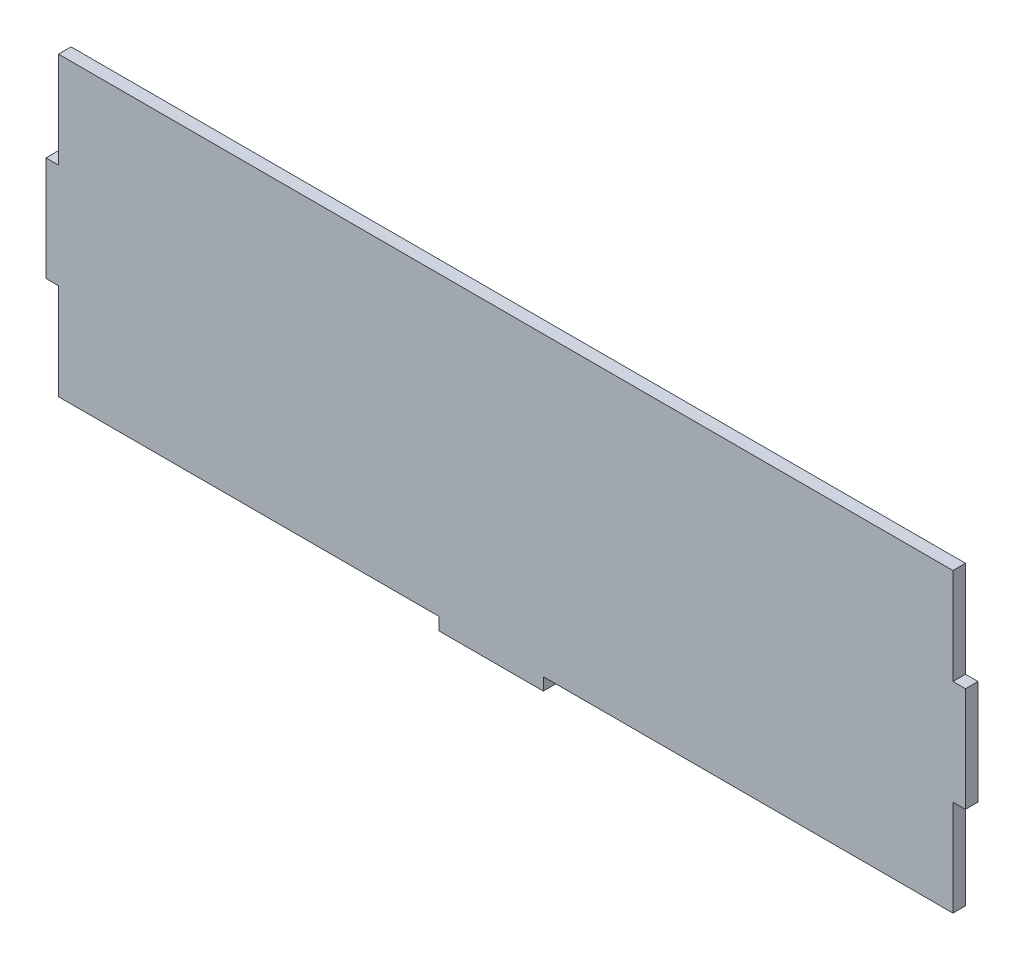
ISO-10303-21;
HEADER;
FILE_DESCRIPTION(('STEP AP214'),'2;1');
FILE_NAME('part.step','',(''),(''),'','','');
FILE_SCHEMA(('AUTOMOTIVE_DESIGN { 1 0 10303 214 1 1 1 1 }'));
ENDSEC;
DATA;
#1=APPLICATION_CONTEXT('core data for automotive mechanical design processes');
#2=APPLICATION_PROTOCOL_DEFINITION('international standard','automotive_design',2000,#1);
#3=PRODUCT_CONTEXT('',#1,'mechanical');
#4=PRODUCT('Part','Part','',(#3));
#5=PRODUCT_RELATED_PRODUCT_CATEGORY('part','',(#4));
#6=PRODUCT_DEFINITION_FORMATION('','',#4);
#7=PRODUCT_DEFINITION_CONTEXT('part definition',#1,'design');
#8=PRODUCT_DEFINITION('design','',#6,#7);
#9=PRODUCT_DEFINITION_SHAPE('','',#8);
#10=(LENGTH_UNIT() NAMED_UNIT(*) SI_UNIT(.MILLI.,.METRE.));
#11=(NAMED_UNIT(*) PLANE_ANGLE_UNIT() SI_UNIT($,.RADIAN.));
#12=(NAMED_UNIT(*) SI_UNIT($,.STERADIAN.) SOLID_ANGLE_UNIT());
#13=UNCERTAINTY_MEASURE_WITH_UNIT(LENGTH_MEASURE(1.E-05),#10,'distance_accuracy_value','');
#14=(GEOMETRIC_REPRESENTATION_CONTEXT(3) GLOBAL_UNCERTAINTY_ASSIGNED_CONTEXT((#13)) GLOBAL_UNIT_ASSIGNED_CONTEXT((#10,
#11,#12)) REPRESENTATION_CONTEXT('',''));
#15=CARTESIAN_POINT('',(0.,0.,0.));
#16=DIRECTION('',(0.,0.,1.));
#17=DIRECTION('',(1.,0.,0.));
#18=AXIS2_PLACEMENT_3D('',#15,#16,#17);
#19=CARTESIAN_POINT('',(0.,0.,6.));
#20=DIRECTION('',(1.,0.,0.));
#21=DIRECTION('',(0.,0.,-1.));
#22=AXIS2_PLACEMENT_3D('',#19,#20,#21);
#23=PLANE('',#22);
#24=DIRECTION('',(0.,-1.,0.));
#25=VECTOR('',#24,1.);
#26=CARTESIAN_POINT('',(0.,0.,0.));
#27=LINE('',#26,#25);
#28=CARTESIAN_POINT('',(0.,0.,0.));
#29=VERTEX_POINT('',#28);
#30=CARTESIAN_POINT('',(0.,-46.,0.));
#31=VERTEX_POINT('',#30);
#32=EDGE_CURVE('E179',#29,#31,#27,.T.);
#33=ORIENTED_EDGE('',*,*,#32,.T.);
#34=DIRECTION('',(0.,0.,-1.));
#35=VECTOR('',#34,1.);
#36=CARTESIAN_POINT('',(0.,-46.,6.));
#37=LINE('',#36,#35);
#38=CARTESIAN_POINT('',(0.,-46.,6.));
#39=VERTEX_POINT('',#38);
#40=EDGE_CURVE('E11',#39,#31,#37,.T.);
#41=ORIENTED_EDGE('',*,*,#40,.F.);
#42=DIRECTION('',(0.,-1.,0.));
#43=VECTOR('',#42,1.);
#44=CARTESIAN_POINT('',(0.,0.,6.));
#45=LINE('',#44,#43);
#46=CARTESIAN_POINT('',(0.,0.,6.));
#47=VERTEX_POINT('',#46);
#48=EDGE_CURVE('E209',#47,#39,#45,.T.);
#49=ORIENTED_EDGE('',*,*,#48,.F.);
#50=DIRECTION('',(0.,0.,-1.));
#51=VECTOR('',#50,1.);
#52=CARTESIAN_POINT('',(0.,0.,6.));
#53=LINE('',#52,#51);
#54=EDGE_CURVE('E175',#47,#29,#53,.T.);
#55=ORIENTED_EDGE('',*,*,#54,.T.);
#56=EDGE_LOOP('',(#33,#41,#49,#55));
#57=FACE_BOUND('',#56,.T.);
#58=ADVANCED_FACE('F35',(#57),#23,.F.);
#59=CARTESIAN_POINT('',(-5.99999999999999,-45.9999999999999,6.));
#60=DIRECTION('',(0.,-1.,0.));
#61=DIRECTION('',(1.,0.,0.));
#62=AXIS2_PLACEMENT_3D('',#59,#60,#61);
#63=PLANE('',#62);
#64=DIRECTION('',(-1.,0.,0.));
#65=VECTOR('',#64,1.);
#66=CARTESIAN_POINT('',(-5.99999999999999,-45.9999999999999,0.));
#67=LINE('',#66,#65);
#68=CARTESIAN_POINT('',(-5.99999999999999,-45.9999999999999,0.));
#69=VERTEX_POINT('',#68);
#70=EDGE_CURVE('E182',#31,#69,#67,.T.);
#71=ORIENTED_EDGE('',*,*,#70,.T.);
#72=DIRECTION('',(0.,0.,-1.));
#73=VECTOR('',#72,1.);
#74=CARTESIAN_POINT('',(-5.99999999999999,-45.9999999999999,6.));
#75=LINE('',#74,#73);
#76=CARTESIAN_POINT('',(-5.99999999999999,-45.9999999999999,6.));
#77=VERTEX_POINT('',#76);
#78=EDGE_CURVE('E43',#77,#69,#75,.T.);
#79=ORIENTED_EDGE('',*,*,#78,.F.);
#80=DIRECTION('',(-1.,0.,0.));
#81=VECTOR('',#80,1.);
#82=CARTESIAN_POINT('',(-5.99999999999999,-45.9999999999999,6.));
#83=LINE('',#82,#81);
#84=EDGE_CURVE('E118',#39,#77,#83,.T.);
#85=ORIENTED_EDGE('',*,*,#84,.F.);
#86=ORIENTED_EDGE('',*,*,#40,.T.);
#87=EDGE_LOOP('',(#71,#79,#85,#86));
#88=FACE_BOUND('',#87,.T.);
#89=ADVANCED_FACE('F307',(#88),#63,.F.);
#90=CARTESIAN_POINT('',(-5.99999999999999,-45.9999999999999,6.));
#91=DIRECTION('',(1.,0.,0.));
#92=DIRECTION('',(0.,1.,0.));
#93=AXIS2_PLACEMENT_3D('',#90,#91,#92);
#94=PLANE('',#93);
#95=DIRECTION('',(0.,-1.,0.));
#96=VECTOR('',#95,1.);
#97=CARTESIAN_POINT('',(-5.99999999999999,-45.9999999999999,0.));
#98=LINE('',#97,#96);
#99=CARTESIAN_POINT('',(-5.99999999999999,-95.9999999999999,0.));
#100=VERTEX_POINT('',#99);
#101=EDGE_CURVE('E184',#69,#100,#98,.T.);
#102=ORIENTED_EDGE('',*,*,#101,.T.);
#103=DIRECTION('',(0.,0.,-1.));
#104=VECTOR('',#103,1.);
#105=CARTESIAN_POINT('',(-5.99999999999999,-95.9999999999999,6.));
#106=LINE('',#105,#104);
#107=CARTESIAN_POINT('',(-5.99999999999999,-95.9999999999999,6.));
#108=VERTEX_POINT('',#107);
#109=EDGE_CURVE('E240',#108,#100,#106,.T.);
#110=ORIENTED_EDGE('',*,*,#109,.F.);
#111=DIRECTION('',(0.,-1.,0.));
#112=VECTOR('',#111,1.);
#113=CARTESIAN_POINT('',(-5.99999999999999,-45.9999999999999,6.));
#114=LINE('',#113,#112);
#115=EDGE_CURVE('E248',#77,#108,#114,.T.);
#116=ORIENTED_EDGE('',*,*,#115,.F.);
#117=ORIENTED_EDGE('',*,*,#78,.T.);
#118=EDGE_LOOP('',(#102,#110,#116,#117));
#119=FACE_BOUND('',#118,.T.);
#120=ADVANCED_FACE('F246',(#119),#94,.F.);
#121=CARTESIAN_POINT('',(-5.99999999999999,-95.9999999999999,6.));
#122=DIRECTION('',(0.,1.,0.));
#123=DIRECTION('',(-1.,0.,0.));
#124=AXIS2_PLACEMENT_3D('',#121,#122,#123);
#125=PLANE('',#124);
#126=DIRECTION('',(1.,0.,0.));
#127=VECTOR('',#126,1.);
#128=CARTESIAN_POINT('',(-5.99999999999999,-95.9999999999999,0.));
#129=LINE('',#128,#127);
#130=CARTESIAN_POINT('',(0.,-96.,0.));
#131=VERTEX_POINT('',#130);
#132=EDGE_CURVE('E186',#100,#131,#129,.T.);
#133=ORIENTED_EDGE('',*,*,#132,.T.);
#134=DIRECTION('',(0.,0.,-1.));
#135=VECTOR('',#134,1.);
#136=CARTESIAN_POINT('',(0.,-96.,6.));
#137=LINE('',#136,#135);
#138=CARTESIAN_POINT('',(0.,-96.,6.));
#139=VERTEX_POINT('',#138);
#140=EDGE_CURVE('E237',#139,#131,#137,.T.);
#141=ORIENTED_EDGE('',*,*,#140,.F.);
#142=DIRECTION('',(1.,0.,0.));
#143=VECTOR('',#142,1.);
#144=CARTESIAN_POINT('',(-5.99999999999999,-95.9999999999999,6.));
#145=LINE('',#144,#143);
#146=EDGE_CURVE('E266',#108,#139,#145,.T.);
#147=ORIENTED_EDGE('',*,*,#146,.F.);
#148=ORIENTED_EDGE('',*,*,#109,.T.);
#149=EDGE_LOOP('',(#133,#141,#147,#148));
#150=FACE_BOUND('',#149,.T.);
#151=ADVANCED_FACE('F257',(#150),#125,.F.);
#152=CARTESIAN_POINT('',(0.,-96.,6.));
#153=DIRECTION('',(1.,0.,0.));
#154=DIRECTION('',(0.,1.,0.));
#155=AXIS2_PLACEMENT_3D('',#152,#153,#154);
#156=PLANE('',#155);
#157=DIRECTION('',(0.,-1.,0.));
#158=VECTOR('',#157,1.);
#159=CARTESIAN_POINT('',(0.,-96.,0.));
#160=LINE('',#159,#158);
#161=CARTESIAN_POINT('',(0.,-142.,0.));
#162=VERTEX_POINT('',#161);
#163=EDGE_CURVE('E188',#131,#162,#160,.T.);
#164=ORIENTED_EDGE('',*,*,#163,.T.);
#165=DIRECTION('',(0.,0.,-1.));
#166=VECTOR('',#165,1.);
#167=CARTESIAN_POINT('',(0.,-142.,6.));
#168=LINE('',#167,#166);
#169=CARTESIAN_POINT('',(0.,-142.,6.));
#170=VERTEX_POINT('',#169);
#171=EDGE_CURVE('E234',#170,#162,#168,.T.);
#172=ORIENTED_EDGE('',*,*,#171,.F.);
#173=DIRECTION('',(0.,-1.,0.));
#174=VECTOR('',#173,1.);
#175=CARTESIAN_POINT('',(0.,-96.,6.));
#176=LINE('',#175,#174);
#177=EDGE_CURVE('E263',#139,#170,#176,.T.);
#178=ORIENTED_EDGE('',*,*,#177,.F.);
#179=ORIENTED_EDGE('',*,*,#140,.T.);
#180=EDGE_LOOP('',(#164,#172,#178,#179));
#181=FACE_BOUND('',#180,.T.);
#182=ADVANCED_FACE('F261',(#181),#156,.F.);
#183=CARTESIAN_POINT('',(0.,-142.,6.));
#184=DIRECTION('',(0.,1.,0.));
#185=DIRECTION('',(0.,0.,1.));
#186=AXIS2_PLACEMENT_3D('',#183,#184,#185);
#187=PLANE('',#186);
#188=DIRECTION('',(1.,0.,0.));
#189=VECTOR('',#188,1.);
#190=CARTESIAN_POINT('',(0.,-142.,0.));
#191=LINE('',#190,#189);
#192=CARTESIAN_POINT('',(182.,-142.,0.));
#193=VERTEX_POINT('',#192);
#194=EDGE_CURVE('E190',#162,#193,#191,.T.);
#195=ORIENTED_EDGE('',*,*,#194,.T.);
#196=DIRECTION('',(0.,0.,-1.));
#197=VECTOR('',#196,1.);
#198=CARTESIAN_POINT('',(182.,-142.,6.));
#199=LINE('',#198,#197);
#200=CARTESIAN_POINT('',(182.,-142.,6.));
#201=VERTEX_POINT('',#200);
#202=EDGE_CURVE('E231',#201,#193,#199,.T.);
#203=ORIENTED_EDGE('',*,*,#202,.F.);
#204=DIRECTION('',(1.,0.,0.));
#205=VECTOR('',#204,1.);
#206=CARTESIAN_POINT('',(0.,-142.,6.));
#207=LINE('',#206,#205);
#208=EDGE_CURVE('E265',#170,#201,#207,.T.);
#209=ORIENTED_EDGE('',*,*,#208,.F.);
#210=ORIENTED_EDGE('',*,*,#171,.T.);
#211=EDGE_LOOP('',(#195,#203,#209,#210));
#212=FACE_BOUND('',#211,.T.);
#213=ADVANCED_FACE('F320',(#212),#187,.F.);
#214=CARTESIAN_POINT('',(182.,-142.,6.));
#215=DIRECTION('',(1.,0.,0.));
#216=DIRECTION('',(0.,0.,-1.));
#217=AXIS2_PLACEMENT_3D('',#214,#215,#216);
#218=PLANE('',#217);
#219=DIRECTION('',(0.,-1.,0.));
#220=VECTOR('',#219,1.);
#221=CARTESIAN_POINT('',(182.,-142.,0.));
#222=LINE('',#221,#220);
#223=CARTESIAN_POINT('',(182.,-148.,0.));
#224=VERTEX_POINT('',#223);
#225=EDGE_CURVE('E192',#193,#224,#222,.T.);
#226=ORIENTED_EDGE('',*,*,#225,.T.);
#227=DIRECTION('',(0.,0.,-1.));
#228=VECTOR('',#227,1.);
#229=CARTESIAN_POINT('',(182.,-148.,6.));
#230=LINE('',#229,#228);
#231=CARTESIAN_POINT('',(182.,-148.,6.));
#232=VERTEX_POINT('',#231);
#233=EDGE_CURVE('E228',#232,#224,#230,.T.);
#234=ORIENTED_EDGE('',*,*,#233,.F.);
#235=DIRECTION('',(0.,-1.,0.));
#236=VECTOR('',#235,1.);
#237=CARTESIAN_POINT('',(182.,-142.,6.));
#238=LINE('',#237,#236);
#239=EDGE_CURVE('E268',#201,#232,#238,.T.);
#240=ORIENTED_EDGE('',*,*,#239,.F.);
#241=ORIENTED_EDGE('',*,*,#202,.T.);
#242=EDGE_LOOP('',(#226,#234,#240,#241));
#243=FACE_BOUND('',#242,.T.);
#244=ADVANCED_FACE('F323',(#243),#218,.F.);
#245=CARTESIAN_POINT('',(182.,-148.,6.));
#246=DIRECTION('',(0.,1.,0.));
#247=DIRECTION('',(0.,0.,1.));
#248=AXIS2_PLACEMENT_3D('',#245,#246,#247);
#249=PLANE('',#248);
#250=DIRECTION('',(1.,0.,0.));
#251=VECTOR('',#250,1.);
#252=CARTESIAN_POINT('',(182.,-148.,0.));
#253=LINE('',#252,#251);
#254=CARTESIAN_POINT('',(232.,-148.,0.));
#255=VERTEX_POINT('',#254);
#256=EDGE_CURVE('E194',#224,#255,#253,.T.);
#257=ORIENTED_EDGE('',*,*,#256,.T.);
#258=DIRECTION('',(0.,0.,-1.));
#259=VECTOR('',#258,1.);
#260=CARTESIAN_POINT('',(232.,-148.,6.));
#261=LINE('',#260,#259);
#262=CARTESIAN_POINT('',(232.,-148.,6.));
#263=VERTEX_POINT('',#262);
#264=EDGE_CURVE('E225',#263,#255,#261,.T.);
#265=ORIENTED_EDGE('',*,*,#264,.F.);
#266=DIRECTION('',(1.,0.,0.));
#267=VECTOR('',#266,1.);
#268=CARTESIAN_POINT('',(182.,-148.,6.));
#269=LINE('',#268,#267);
#270=EDGE_CURVE('E274',#232,#263,#269,.T.);
#271=ORIENTED_EDGE('',*,*,#270,.F.);
#272=ORIENTED_EDGE('',*,*,#233,.T.);
#273=EDGE_LOOP('',(#257,#265,#271,#272));
#274=FACE_BOUND('',#273,.T.);
#275=ADVANCED_FACE('F327',(#274),#249,.F.);
#276=CARTESIAN_POINT('',(232.,-142.,6.));
#277=DIRECTION('',(-1.,0.,0.));
#278=DIRECTION('',(0.,0.,1.));
#279=AXIS2_PLACEMENT_3D('',#276,#277,#278);
#280=PLANE('',#279);
#281=DIRECTION('',(0.,1.,0.));
#282=VECTOR('',#281,1.);
#283=CARTESIAN_POINT('',(232.,-142.,0.));
#284=LINE('',#283,#282);
#285=CARTESIAN_POINT('',(232.,-142.,0.));
#286=VERTEX_POINT('',#285);
#287=EDGE_CURVE('E196',#255,#286,#284,.T.);
#288=ORIENTED_EDGE('',*,*,#287,.T.);
#289=DIRECTION('',(0.,0.,-1.));
#290=VECTOR('',#289,1.);
#291=CARTESIAN_POINT('',(232.,-142.,6.));
#292=LINE('',#291,#290);
#293=CARTESIAN_POINT('',(232.,-142.,6.));
#294=VERTEX_POINT('',#293);
#295=EDGE_CURVE('E222',#294,#286,#292,.T.);
#296=ORIENTED_EDGE('',*,*,#295,.F.);
#297=DIRECTION('',(0.,1.,0.));
#298=VECTOR('',#297,1.);
#299=CARTESIAN_POINT('',(232.,-142.,6.));
#300=LINE('',#299,#298);
#301=EDGE_CURVE('E276',#263,#294,#300,.T.);
#302=ORIENTED_EDGE('',*,*,#301,.F.);
#303=ORIENTED_EDGE('',*,*,#264,.T.);
#304=EDGE_LOOP('',(#288,#296,#302,#303));
#305=FACE_BOUND('',#304,.T.);
#306=ADVANCED_FACE('F331',(#305),#280,.F.);
#307=CARTESIAN_POINT('',(232.,-142.,6.));
#308=DIRECTION('',(0.,1.,0.));
#309=DIRECTION('',(-1.,0.,0.));
#310=AXIS2_PLACEMENT_3D('',#307,#308,#309);
#311=PLANE('',#310);
#312=DIRECTION('',(1.,0.,0.));
#313=VECTOR('',#312,1.);
#314=CARTESIAN_POINT('',(232.,-142.,0.));
#315=LINE('',#314,#313);
#316=CARTESIAN_POINT('',(428.,-142.,0.));
#317=VERTEX_POINT('',#316);
#318=EDGE_CURVE('E198',#286,#317,#315,.T.);
#319=ORIENTED_EDGE('',*,*,#318,.T.);
#320=DIRECTION('',(0.,0.,-1.));
#321=VECTOR('',#320,1.);
#322=CARTESIAN_POINT('',(428.,-142.,6.));
#323=LINE('',#322,#321);
#324=CARTESIAN_POINT('',(428.,-142.,6.));
#325=VERTEX_POINT('',#324);
#326=EDGE_CURVE('E219',#325,#317,#323,.T.);
#327=ORIENTED_EDGE('',*,*,#326,.F.);
#328=DIRECTION('',(1.,0.,0.));
#329=VECTOR('',#328,1.);
#330=CARTESIAN_POINT('',(232.,-142.,6.));
#331=LINE('',#330,#329);
#332=EDGE_CURVE('E278',#294,#325,#331,.T.);
#333=ORIENTED_EDGE('',*,*,#332,.F.);
#334=ORIENTED_EDGE('',*,*,#295,.T.);
#335=EDGE_LOOP('',(#319,#327,#333,#334));
#336=FACE_BOUND('',#335,.T.);
#337=ADVANCED_FACE('F335',(#336),#311,.F.);
#338=CARTESIAN_POINT('',(428.,-95.9999999999999,6.));
#339=DIRECTION('',(-1.,0.,0.));
#340=DIRECTION('',(0.,0.,1.));
#341=AXIS2_PLACEMENT_3D('',#338,#339,#340);
#342=PLANE('',#341);
#343=DIRECTION('',(0.,1.,0.));
#344=VECTOR('',#343,1.);
#345=CARTESIAN_POINT('',(428.,-95.9999999999999,0.));
#346=LINE('',#345,#344);
#347=CARTESIAN_POINT('',(428.,-95.9999999999999,0.));
#348=VERTEX_POINT('',#347);
#349=EDGE_CURVE('E200',#317,#348,#346,.T.);
#350=ORIENTED_EDGE('',*,*,#349,.T.);
#351=DIRECTION('',(0.,0.,-1.));
#352=VECTOR('',#351,1.);
#353=CARTESIAN_POINT('',(428.,-95.9999999999999,6.));
#354=LINE('',#353,#352);
#355=CARTESIAN_POINT('',(428.,-95.9999999999999,6.));
#356=VERTEX_POINT('',#355);
#357=EDGE_CURVE('E216',#356,#348,#354,.T.);
#358=ORIENTED_EDGE('',*,*,#357,.F.);
#359=DIRECTION('',(0.,1.,0.));
#360=VECTOR('',#359,1.);
#361=CARTESIAN_POINT('',(428.,-95.9999999999999,6.));
#362=LINE('',#361,#360);
#363=EDGE_CURVE('E280',#325,#356,#362,.T.);
#364=ORIENTED_EDGE('',*,*,#363,.F.);
#365=ORIENTED_EDGE('',*,*,#326,.T.);
#366=EDGE_LOOP('',(#350,#358,#364,#365));
#367=FACE_BOUND('',#366,.T.);
#368=ADVANCED_FACE('F339',(#367),#342,.F.);
#369=CARTESIAN_POINT('',(434.,-95.9999999999999,6.));
#370=DIRECTION('',(0.,1.,0.));
#371=DIRECTION('',(-1.,0.,0.));
#372=AXIS2_PLACEMENT_3D('',#369,#370,#371);
#373=PLANE('',#372);
#374=DIRECTION('',(1.,0.,0.));
#375=VECTOR('',#374,1.);
#376=CARTESIAN_POINT('',(434.,-95.9999999999999,0.));
#377=LINE('',#376,#375);
#378=CARTESIAN_POINT('',(434.,-95.9999999999999,0.));
#379=VERTEX_POINT('',#378);
#380=EDGE_CURVE('E202',#348,#379,#377,.T.);
#381=ORIENTED_EDGE('',*,*,#380,.T.);
#382=DIRECTION('',(0.,0.,-1.));
#383=VECTOR('',#382,1.);
#384=CARTESIAN_POINT('',(434.,-95.9999999999999,6.));
#385=LINE('',#384,#383);
#386=CARTESIAN_POINT('',(434.,-95.9999999999999,6.));
#387=VERTEX_POINT('',#386);
#388=EDGE_CURVE('E213',#387,#379,#385,.T.);
#389=ORIENTED_EDGE('',*,*,#388,.F.);
#390=DIRECTION('',(1.,0.,0.));
#391=VECTOR('',#390,1.);
#392=CARTESIAN_POINT('',(434.,-95.9999999999999,6.));
#393=LINE('',#392,#391);
#394=EDGE_CURVE('E282',#356,#387,#393,.T.);
#395=ORIENTED_EDGE('',*,*,#394,.F.);
#396=ORIENTED_EDGE('',*,*,#357,.T.);
#397=EDGE_LOOP('',(#381,#389,#395,#396));
#398=FACE_BOUND('',#397,.T.);
#399=ADVANCED_FACE('F288',(#398),#373,.F.);
#400=CARTESIAN_POINT('',(434.,-45.9999999999999,6.));
#401=DIRECTION('',(-1.,0.,0.));
#402=DIRECTION('',(0.,-1.,0.));
#403=AXIS2_PLACEMENT_3D('',#400,#401,#402);
#404=PLANE('',#403);
#405=DIRECTION('',(0.,1.,0.));
#406=VECTOR('',#405,1.);
#407=CARTESIAN_POINT('',(434.,-45.9999999999999,0.));
#408=LINE('',#407,#406);
#409=CARTESIAN_POINT('',(434.,-45.9999999999999,0.));
#410=VERTEX_POINT('',#409);
#411=EDGE_CURVE('E204',#379,#410,#408,.T.);
#412=ORIENTED_EDGE('',*,*,#411,.T.);
#413=DIRECTION('',(0.,0.,-1.));
#414=VECTOR('',#413,1.);
#415=CARTESIAN_POINT('',(434.,-45.9999999999999,6.));
#416=LINE('',#415,#414);
#417=CARTESIAN_POINT('',(434.,-45.9999999999999,6.));
#418=VERTEX_POINT('',#417);
#419=EDGE_CURVE('E170',#418,#410,#416,.T.);
#420=ORIENTED_EDGE('',*,*,#419,.F.);
#421=DIRECTION('',(0.,1.,0.));
#422=VECTOR('',#421,1.);
#423=CARTESIAN_POINT('',(434.,-45.9999999999999,6.));
#424=LINE('',#423,#422);
#425=EDGE_CURVE('E161',#387,#418,#424,.T.);
#426=ORIENTED_EDGE('',*,*,#425,.F.);
#427=ORIENTED_EDGE('',*,*,#388,.T.);
#428=EDGE_LOOP('',(#412,#420,#426,#427));
#429=FACE_BOUND('',#428,.T.);
#430=ADVANCED_FACE('F292',(#429),#404,.F.);
#431=CARTESIAN_POINT('',(434.,-45.9999999999999,6.));
#432=DIRECTION('',(0.,-1.,0.));
#433=DIRECTION('',(1.,0.,0.));
#434=AXIS2_PLACEMENT_3D('',#431,#432,#433);
#435=PLANE('',#434);
#436=DIRECTION('',(-1.,0.,0.));
#437=VECTOR('',#436,1.);
#438=CARTESIAN_POINT('',(434.,-45.9999999999999,0.));
#439=LINE('',#438,#437);
#440=CARTESIAN_POINT('',(428.,-45.9999999999999,0.));
#441=VERTEX_POINT('',#440);
#442=EDGE_CURVE('E169',#410,#441,#439,.T.);
#443=ORIENTED_EDGE('',*,*,#442,.T.);
#444=DIRECTION('',(0.,0.,-1.));
#445=VECTOR('',#444,1.);
#446=CARTESIAN_POINT('',(428.,-45.9999999999999,6.));
#447=LINE('',#446,#445);
#448=CARTESIAN_POINT('',(428.,-45.9999999999999,6.));
#449=VERTEX_POINT('',#448);
#450=EDGE_CURVE('E166',#449,#441,#447,.T.);
#451=ORIENTED_EDGE('',*,*,#450,.F.);
#452=DIRECTION('',(-1.,0.,0.));
#453=VECTOR('',#452,1.);
#454=CARTESIAN_POINT('',(434.,-45.9999999999999,6.));
#455=LINE('',#454,#453);
#456=EDGE_CURVE('E155',#418,#449,#455,.T.);
#457=ORIENTED_EDGE('',*,*,#456,.F.);
#458=ORIENTED_EDGE('',*,*,#419,.T.);
#459=EDGE_LOOP('',(#443,#451,#457,#458));
#460=FACE_BOUND('',#459,.T.);
#461=ADVANCED_FACE('F167',(#460),#435,.F.);
#462=CARTESIAN_POINT('',(428.,0.,6.));
#463=DIRECTION('',(-1.,0.,0.));
#464=DIRECTION('',(0.,0.,1.));
#465=AXIS2_PLACEMENT_3D('',#462,#463,#464);
#466=PLANE('',#465);
#467=DIRECTION('',(0.,1.,0.));
#468=VECTOR('',#467,1.);
#469=CARTESIAN_POINT('',(428.,0.,0.));
#470=LINE('',#469,#468);
#471=CARTESIAN_POINT('',(428.,0.,0.));
#472=VERTEX_POINT('',#471);
#473=EDGE_CURVE('E104',#441,#472,#470,.T.);
#474=ORIENTED_EDGE('',*,*,#473,.T.);
#475=DIRECTION('',(0.,0.,-1.));
#476=VECTOR('',#475,1.);
#477=CARTESIAN_POINT('',(428.,0.,6.));
#478=LINE('',#477,#476);
#479=CARTESIAN_POINT('',(428.,0.,6.));
#480=VERTEX_POINT('',#479);
#481=EDGE_CURVE('E171',#480,#472,#478,.T.);
#482=ORIENTED_EDGE('',*,*,#481,.F.);
#483=DIRECTION('',(0.,1.,0.));
#484=VECTOR('',#483,1.);
#485=CARTESIAN_POINT('',(428.,0.,6.));
#486=LINE('',#485,#484);
#487=EDGE_CURVE('E159',#449,#480,#486,.T.);
#488=ORIENTED_EDGE('',*,*,#487,.F.);
#489=ORIENTED_EDGE('',*,*,#450,.T.);
#490=EDGE_LOOP('',(#474,#482,#488,#489));
#491=FACE_BOUND('',#490,.T.);
#492=ADVANCED_FACE('F173',(#491),#466,.F.);
#493=CARTESIAN_POINT('',(0.,0.,6.));
#494=DIRECTION('',(0.,-1.,0.));
#495=DIRECTION('',(1.,0.,0.));
#496=AXIS2_PLACEMENT_3D('',#493,#494,#495);
#497=PLANE('',#496);
#498=DIRECTION('',(-1.,0.,0.));
#499=VECTOR('',#498,1.);
#500=CARTESIAN_POINT('',(0.,0.,0.));
#501=LINE('',#500,#499);
#502=EDGE_CURVE('E110',#472,#29,#501,.T.);
#503=ORIENTED_EDGE('',*,*,#502,.T.);
#504=ORIENTED_EDGE('',*,*,#54,.F.);
#505=DIRECTION('',(-1.,0.,0.));
#506=VECTOR('',#505,1.);
#507=CARTESIAN_POINT('',(0.,0.,6.));
#508=LINE('',#507,#506);
#509=EDGE_CURVE('E51',#480,#47,#508,.T.);
#510=ORIENTED_EDGE('',*,*,#509,.F.);
#511=ORIENTED_EDGE('',*,*,#481,.T.);
#512=EDGE_LOOP('',(#503,#504,#510,#511));
#513=FACE_BOUND('',#512,.T.);
#514=ADVANCED_FACE('F296',(#513),#497,.F.);
#515=CARTESIAN_POINT('',(0.,0.,6.));
#516=DIRECTION('',(0.,0.,1.));
#517=DIRECTION('',(1.,0.,0.));
#518=AXIS2_PLACEMENT_3D('',#515,#516,#517);
#519=PLANE('',#518);
#520=ORIENTED_EDGE('',*,*,#48,.T.);
#521=ORIENTED_EDGE('',*,*,#84,.T.);
#522=ORIENTED_EDGE('',*,*,#115,.T.);
#523=ORIENTED_EDGE('',*,*,#146,.T.);
#524=ORIENTED_EDGE('',*,*,#177,.T.);
#525=ORIENTED_EDGE('',*,*,#208,.T.);
#526=ORIENTED_EDGE('',*,*,#239,.T.);
#527=ORIENTED_EDGE('',*,*,#270,.T.);
#528=ORIENTED_EDGE('',*,*,#301,.T.);
#529=ORIENTED_EDGE('',*,*,#332,.T.);
#530=ORIENTED_EDGE('',*,*,#363,.T.);
#531=ORIENTED_EDGE('',*,*,#394,.T.);
#532=ORIENTED_EDGE('',*,*,#425,.T.);
#533=ORIENTED_EDGE('',*,*,#456,.T.);
#534=ORIENTED_EDGE('',*,*,#487,.T.);
#535=ORIENTED_EDGE('',*,*,#509,.T.);
#536=EDGE_LOOP('',(#520,#521,#522,#523,#524,#525,#526,#527,#528,#529,#530,#531,#532,#533,#534,#535));
#537=FACE_BOUND('',#536,.T.);
#538=ADVANCED_FACE('F157',(#537),#519,.T.);
#539=CARTESIAN_POINT('',(0.,0.,0.));
#540=DIRECTION('',(0.,0.,1.));
#541=DIRECTION('',(1.,0.,0.));
#542=AXIS2_PLACEMENT_3D('',#539,#540,#541);
#543=PLANE('',#542);
#544=ORIENTED_EDGE('',*,*,#32,.F.);
#545=ORIENTED_EDGE('',*,*,#502,.F.);
#546=ORIENTED_EDGE('',*,*,#473,.F.);
#547=ORIENTED_EDGE('',*,*,#442,.F.);
#548=ORIENTED_EDGE('',*,*,#411,.F.);
#549=ORIENTED_EDGE('',*,*,#380,.F.);
#550=ORIENTED_EDGE('',*,*,#349,.F.);
#551=ORIENTED_EDGE('',*,*,#318,.F.);
#552=ORIENTED_EDGE('',*,*,#287,.F.);
#553=ORIENTED_EDGE('',*,*,#256,.F.);
#554=ORIENTED_EDGE('',*,*,#225,.F.);
#555=ORIENTED_EDGE('',*,*,#194,.F.);
#556=ORIENTED_EDGE('',*,*,#163,.F.);
#557=ORIENTED_EDGE('',*,*,#132,.F.);
#558=ORIENTED_EDGE('',*,*,#101,.F.);
#559=ORIENTED_EDGE('',*,*,#70,.F.);
#560=EDGE_LOOP('',(#544,#545,#546,#547,#548,#549,#550,#551,#552,#553,#554,#555,#556,#557,#558,#559));
#561=FACE_BOUND('',#560,.T.);
#562=ADVANCED_FACE('F252',(#561),#543,.F.);
#563=CLOSED_SHELL('',(#58,#89,#120,#151,#182,#213,#244,#275,#306,#337,#368,#399,#430,#461,#492,
#514,#538,#562));
#564=MANIFOLD_SOLID_BREP('B2',#563);
#565=ADVANCED_BREP_SHAPE_REPRESENTATION('',(#18,#564),#14);
#566=SHAPE_DEFINITION_REPRESENTATION(#9,#565);
ENDSEC;
END-ISO-10303-21;
